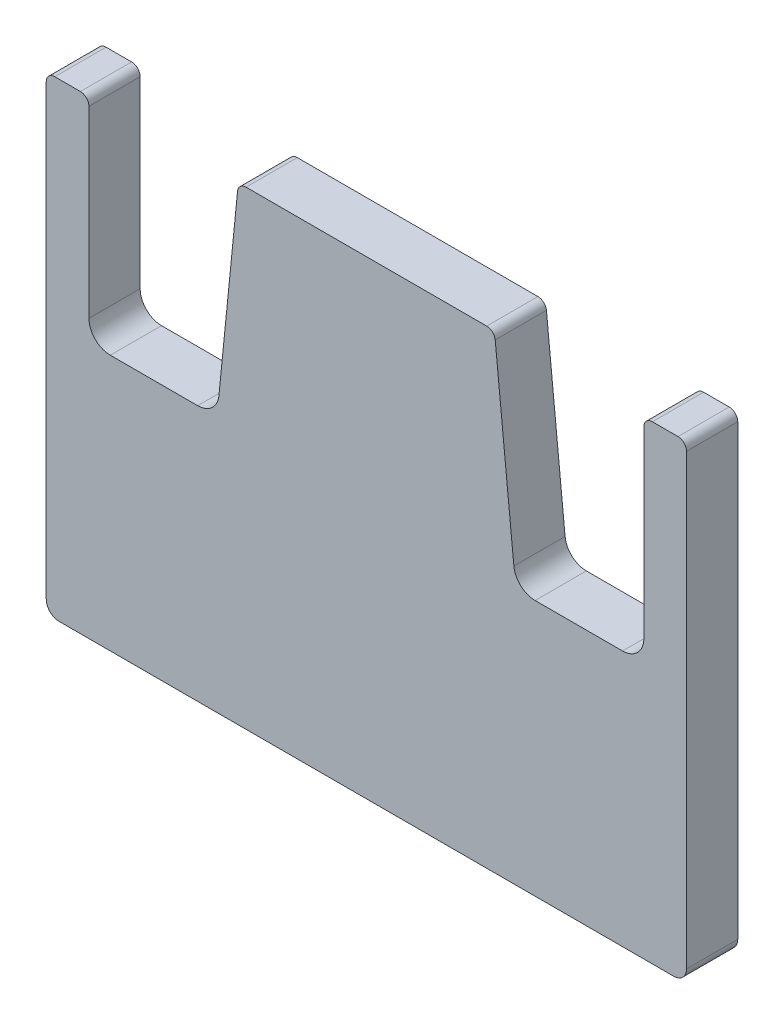
ISO-10303-21;
HEADER;
FILE_DESCRIPTION(('STEP AP214'),'2;1');
FILE_NAME('part.step','',(''),(''),'','','');
FILE_SCHEMA(('AUTOMOTIVE_DESIGN { 1 0 10303 214 1 1 1 1 }'));
ENDSEC;
DATA;
#1=APPLICATION_CONTEXT('core data for automotive mechanical design processes');
#2=APPLICATION_PROTOCOL_DEFINITION('international standard','automotive_design',2000,#1);
#3=PRODUCT_CONTEXT('',#1,'mechanical');
#4=PRODUCT('Part','Part','',(#3));
#5=PRODUCT_RELATED_PRODUCT_CATEGORY('part','',(#4));
#6=PRODUCT_DEFINITION_FORMATION('','',#4);
#7=PRODUCT_DEFINITION_CONTEXT('part definition',#1,'design');
#8=PRODUCT_DEFINITION('design','',#6,#7);
#9=PRODUCT_DEFINITION_SHAPE('','',#8);
#10=(LENGTH_UNIT() NAMED_UNIT(*) SI_UNIT(.MILLI.,.METRE.));
#11=(NAMED_UNIT(*) PLANE_ANGLE_UNIT() SI_UNIT($,.RADIAN.));
#12=(NAMED_UNIT(*) SI_UNIT($,.STERADIAN.) SOLID_ANGLE_UNIT());
#13=UNCERTAINTY_MEASURE_WITH_UNIT(LENGTH_MEASURE(1.E-05),#10,'distance_accuracy_value','');
#14=(GEOMETRIC_REPRESENTATION_CONTEXT(3) GLOBAL_UNCERTAINTY_ASSIGNED_CONTEXT((#13)) GLOBAL_UNIT_ASSIGNED_CONTEXT((#10,
#11,#12)) REPRESENTATION_CONTEXT('',''));
#15=CARTESIAN_POINT('',(0.,0.,0.));
#16=DIRECTION('',(0.,0.,1.));
#17=DIRECTION('',(1.,0.,0.));
#18=AXIS2_PLACEMENT_3D('',#15,#16,#17);
#19=CARTESIAN_POINT('',(150.,110.,12.));
#20=DIRECTION('',(0.,-1.,0.));
#21=DIRECTION('',(1.,0.,0.));
#22=AXIS2_PLACEMENT_3D('',#19,#20,#21);
#23=PLANE('',#22);
#24=DIRECTION('',(-1.,0.,0.));
#25=VECTOR('',#24,1.);
#26=CARTESIAN_POINT('',(150.,110.,0.));
#27=LINE('',#26,#25);
#28=CARTESIAN_POINT('',(8.00000000000001,110.,0.));
#29=VERTEX_POINT('',#28);
#30=CARTESIAN_POINT('',(2.,110.,0.));
#31=VERTEX_POINT('',#30);
#32=EDGE_CURVE('E254',#29,#31,#27,.T.);
#33=ORIENTED_EDGE('',*,*,#32,.T.);
#34=DIRECTION('',(0.,0.,-1.));
#35=VECTOR('',#34,1.);
#36=CARTESIAN_POINT('',(2.,110.,12.));
#37=LINE('',#36,#35);
#38=CARTESIAN_POINT('',(2.,110.,12.));
#39=VERTEX_POINT('',#38);
#40=EDGE_CURVE('E327',#31,#39,#37,.F.);
#41=ORIENTED_EDGE('',*,*,#40,.T.);
#42=DIRECTION('',(-1.,0.,0.));
#43=VECTOR('',#42,1.);
#44=CARTESIAN_POINT('',(150.,110.,12.));
#45=LINE('',#44,#43);
#46=CARTESIAN_POINT('',(8.00000000000001,110.,12.));
#47=VERTEX_POINT('',#46);
#48=EDGE_CURVE('E245',#47,#39,#45,.T.);
#49=ORIENTED_EDGE('',*,*,#48,.F.);
#50=DIRECTION('',(0.,0.,1.));
#51=VECTOR('',#50,1.);
#52=CARTESIAN_POINT('',(8.00000000000001,110.,12.));
#53=LINE('',#52,#51);
#54=EDGE_CURVE('E325',#47,#29,#53,.F.);
#55=ORIENTED_EDGE('',*,*,#54,.T.);
#56=EDGE_LOOP('',(#33,#41,#49,#55));
#57=FACE_BOUND('',#56,.T.);
#58=ADVANCED_FACE('F33',(#57),#23,.F.);
#59=CARTESIAN_POINT('',(148.,110.,12.));
#60=VERTEX_POINT('',#59);
#61=CARTESIAN_POINT('',(142.,110.,12.));
#62=VERTEX_POINT('',#61);
#63=EDGE_CURVE('E218',#60,#62,#45,.T.);
#64=ORIENTED_EDGE('',*,*,#63,.F.);
#65=DIRECTION('',(0.,0.,-1.));
#66=VECTOR('',#65,1.);
#67=CARTESIAN_POINT('',(148.,110.,12.));
#68=LINE('',#67,#66);
#69=CARTESIAN_POINT('',(148.,110.,0.));
#70=VERTEX_POINT('',#69);
#71=EDGE_CURVE('E292',#60,#70,#68,.T.);
#72=ORIENTED_EDGE('',*,*,#71,.T.);
#73=CARTESIAN_POINT('',(142.,110.,0.));
#74=VERTEX_POINT('',#73);
#75=EDGE_CURVE('E241',#70,#74,#27,.T.);
#76=ORIENTED_EDGE('',*,*,#75,.T.);
#77=DIRECTION('',(0.,0.,1.));
#78=VECTOR('',#77,1.);
#79=CARTESIAN_POINT('',(142.,110.,12.));
#80=LINE('',#79,#78);
#81=EDGE_CURVE('E289',#74,#62,#80,.T.);
#82=ORIENTED_EDGE('',*,*,#81,.T.);
#83=EDGE_LOOP('',(#64,#72,#76,#82));
#84=FACE_BOUND('',#83,.T.);
#85=ADVANCED_FACE('F392',(#84),#23,.F.);
#86=CARTESIAN_POINT('',(0.,0.,12.));
#87=DIRECTION('',(1.,0.,0.));
#88=DIRECTION('',(0.,0.,-1.));
#89=AXIS2_PLACEMENT_3D('',#86,#87,#88);
#90=PLANE('',#89);
#91=DIRECTION('',(0.,-1.,0.));
#92=VECTOR('',#91,1.);
#93=CARTESIAN_POINT('',(0.,0.,0.));
#94=LINE('',#93,#92);
#95=CARTESIAN_POINT('',(0.,108.,0.));
#96=VERTEX_POINT('',#95);
#97=CARTESIAN_POINT('',(0.,3.,0.));
#98=VERTEX_POINT('',#97);
#99=EDGE_CURVE('E237',#96,#98,#94,.T.);
#100=ORIENTED_EDGE('',*,*,#99,.T.);
#101=DIRECTION('',(0.,0.,-1.));
#102=VECTOR('',#101,1.);
#103=CARTESIAN_POINT('',(0.,3.,12.));
#104=LINE('',#103,#102);
#105=CARTESIAN_POINT('',(0.,3.,12.));
#106=VERTEX_POINT('',#105);
#107=EDGE_CURVE('E11',#98,#106,#104,.F.);
#108=ORIENTED_EDGE('',*,*,#107,.T.);
#109=DIRECTION('',(0.,-1.,0.));
#110=VECTOR('',#109,1.);
#111=CARTESIAN_POINT('',(0.,0.,12.));
#112=LINE('',#111,#110);
#113=CARTESIAN_POINT('',(0.,108.,12.));
#114=VERTEX_POINT('',#113);
#115=EDGE_CURVE('E238',#114,#106,#112,.T.);
#116=ORIENTED_EDGE('',*,*,#115,.F.);
#117=DIRECTION('',(0.,0.,-1.));
#118=VECTOR('',#117,1.);
#119=CARTESIAN_POINT('',(0.,108.,12.));
#120=LINE('',#119,#118);
#121=EDGE_CURVE('E322',#114,#96,#120,.T.);
#122=ORIENTED_EDGE('',*,*,#121,.T.);
#123=EDGE_LOOP('',(#100,#108,#116,#122));
#124=FACE_BOUND('',#123,.T.);
#125=ADVANCED_FACE('F374',(#124),#90,.F.);
#126=CARTESIAN_POINT('',(0.,0.,12.));
#127=DIRECTION('',(0.,1.,0.));
#128=DIRECTION('',(-1.,0.,0.));
#129=AXIS2_PLACEMENT_3D('',#126,#127,#128);
#130=PLANE('',#129);
#131=DIRECTION('',(1.,0.,0.));
#132=VECTOR('',#131,1.);
#133=CARTESIAN_POINT('',(0.,0.,0.));
#134=LINE('',#133,#132);
#135=CARTESIAN_POINT('',(3.,0.,0.));
#136=VERTEX_POINT('',#135);
#137=CARTESIAN_POINT('',(147.,0.,0.));
#138=VERTEX_POINT('',#137);
#139=EDGE_CURVE('E250',#136,#138,#134,.T.);
#140=ORIENTED_EDGE('',*,*,#139,.T.);
#141=DIRECTION('',(0.,0.,-1.));
#142=VECTOR('',#141,1.);
#143=CARTESIAN_POINT('',(147.,0.,12.));
#144=LINE('',#143,#142);
#145=CARTESIAN_POINT('',(147.,0.,12.));
#146=VERTEX_POINT('',#145);
#147=EDGE_CURVE('E54',#138,#146,#144,.F.);
#148=ORIENTED_EDGE('',*,*,#147,.T.);
#149=DIRECTION('',(1.,0.,0.));
#150=VECTOR('',#149,1.);
#151=CARTESIAN_POINT('',(0.,0.,12.));
#152=LINE('',#151,#150);
#153=CARTESIAN_POINT('',(3.,0.,12.));
#154=VERTEX_POINT('',#153);
#155=EDGE_CURVE('E240',#154,#146,#152,.T.);
#156=ORIENTED_EDGE('',*,*,#155,.F.);
#157=DIRECTION('',(0.,0.,-1.));
#158=VECTOR('',#157,1.);
#159=CARTESIAN_POINT('',(3.,0.,12.));
#160=LINE('',#159,#158);
#161=EDGE_CURVE('E351',#154,#136,#160,.T.);
#162=ORIENTED_EDGE('',*,*,#161,.T.);
#163=EDGE_LOOP('',(#140,#148,#156,#162));
#164=FACE_BOUND('',#163,.T.);
#165=ADVANCED_FACE('F369',(#164),#130,.F.);
#166=CARTESIAN_POINT('',(150.,0.,12.));
#167=DIRECTION('',(-1.,0.,0.));
#168=DIRECTION('',(0.,-1.,0.));
#169=AXIS2_PLACEMENT_3D('',#166,#167,#168);
#170=PLANE('',#169);
#171=DIRECTION('',(0.,1.,0.));
#172=VECTOR('',#171,1.);
#173=CARTESIAN_POINT('',(150.,0.,12.));
#174=LINE('',#173,#172);
#175=CARTESIAN_POINT('',(150.,3.00000000000002,12.));
#176=VERTEX_POINT('',#175);
#177=CARTESIAN_POINT('',(150.,108.,12.));
#178=VERTEX_POINT('',#177);
#179=EDGE_CURVE('E243',#176,#178,#174,.T.);
#180=ORIENTED_EDGE('',*,*,#179,.F.);
#181=DIRECTION('',(0.,0.,-1.));
#182=VECTOR('',#181,1.);
#183=CARTESIAN_POINT('',(150.,3.00000000000002,12.));
#184=LINE('',#183,#182);
#185=CARTESIAN_POINT('',(150.,3.00000000000002,0.));
#186=VERTEX_POINT('',#185);
#187=EDGE_CURVE('E344',#176,#186,#184,.T.);
#188=ORIENTED_EDGE('',*,*,#187,.T.);
#189=DIRECTION('',(0.,1.,0.));
#190=VECTOR('',#189,1.);
#191=CARTESIAN_POINT('',(150.,0.,0.));
#192=LINE('',#191,#190);
#193=CARTESIAN_POINT('',(150.,108.,0.));
#194=VERTEX_POINT('',#193);
#195=EDGE_CURVE('E252',#186,#194,#192,.T.);
#196=ORIENTED_EDGE('',*,*,#195,.T.);
#197=DIRECTION('',(0.,0.,-1.));
#198=VECTOR('',#197,1.);
#199=CARTESIAN_POINT('',(150.,108.,12.));
#200=LINE('',#199,#198);
#201=EDGE_CURVE('E308',#194,#178,#200,.F.);
#202=ORIENTED_EDGE('',*,*,#201,.T.);
#203=EDGE_LOOP('',(#180,#188,#196,#202));
#204=FACE_BOUND('',#203,.T.);
#205=ADVANCED_FACE('F361',(#204),#170,.F.);
#206=CARTESIAN_POINT('',(103.190024875776,110.,12.));
#207=VERTEX_POINT('',#206);
#208=CARTESIAN_POINT('',(46.8099751242242,110.,12.));
#209=VERTEX_POINT('',#208);
#210=EDGE_CURVE('E246',#207,#209,#45,.T.);
#211=ORIENTED_EDGE('',*,*,#210,.F.);
#212=DIRECTION('',(0.,0.,1.));
#213=VECTOR('',#212,1.);
#214=CARTESIAN_POINT('',(103.190024875776,110.,12.));
#215=LINE('',#214,#213);
#216=CARTESIAN_POINT('',(103.190024875776,110.,0.));
#217=VERTEX_POINT('',#216);
#218=EDGE_CURVE('E337',#207,#217,#215,.F.);
#219=ORIENTED_EDGE('',*,*,#218,.T.);
#220=CARTESIAN_POINT('',(46.8099751242242,110.,0.));
#221=VERTEX_POINT('',#220);
#222=EDGE_CURVE('E255',#217,#221,#27,.T.);
#223=ORIENTED_EDGE('',*,*,#222,.T.);
#224=DIRECTION('',(0.,0.,1.));
#225=VECTOR('',#224,1.);
#226=CARTESIAN_POINT('',(46.8099751242242,110.,12.));
#227=LINE('',#226,#225);
#228=EDGE_CURVE('E334',#221,#209,#227,.T.);
#229=ORIENTED_EDGE('',*,*,#228,.T.);
#230=EDGE_LOOP('',(#211,#219,#223,#229));
#231=FACE_BOUND('',#230,.T.);
#232=ADVANCED_FACE('F432',(#231),#23,.F.);
#233=CARTESIAN_POINT('',(0.,0.,12.));
#234=DIRECTION('',(0.,0.,1.));
#235=DIRECTION('',(1.,0.,0.));
#236=AXIS2_PLACEMENT_3D('',#233,#234,#235);
#237=PLANE('',#236);
#238=ORIENTED_EDGE('',*,*,#155,.T.);
#239=CARTESIAN_POINT('',(147.,3.00000000000002,12.));
#240=DIRECTION('',(0.,0.,1.));
#241=DIRECTION('',(1.,0.,0.));
#242=AXIS2_PLACEMENT_3D('',#239,#240,#241);
#243=CIRCLE('',#242,3.);
#244=EDGE_CURVE('E41',#146,#176,#243,.T.);
#245=ORIENTED_EDGE('',*,*,#244,.T.);
#246=ORIENTED_EDGE('',*,*,#179,.T.);
#247=CARTESIAN_POINT('',(148.,108.,12.));
#248=DIRECTION('',(0.,0.,1.));
#249=DIRECTION('',(1.,0.,0.));
#250=AXIS2_PLACEMENT_3D('',#247,#248,#249);
#251=CIRCLE('',#250,2.);
#252=EDGE_CURVE('E320',#178,#60,#251,.T.);
#253=ORIENTED_EDGE('',*,*,#252,.T.);
#254=ORIENTED_EDGE('',*,*,#63,.T.);
#255=CARTESIAN_POINT('',(142.,108.,12.));
#256=DIRECTION('',(0.,0.,1.));
#257=DIRECTION('',(1.,0.,0.));
#258=AXIS2_PLACEMENT_3D('',#255,#256,#257);
#259=CIRCLE('',#258,2.);
#260=CARTESIAN_POINT('',(140.,108.,12.));
#261=VERTEX_POINT('',#260);
#262=EDGE_CURVE('E222',#62,#261,#259,.T.);
#263=ORIENTED_EDGE('',*,*,#262,.T.);
#264=DIRECTION('',(0.,1.,0.));
#265=VECTOR('',#264,1.);
#266=CARTESIAN_POINT('',(140.,0.,12.));
#267=LINE('',#266,#265);
#268=CARTESIAN_POINT('',(140.,65.,12.));
#269=VERTEX_POINT('',#268);
#270=EDGE_CURVE('E213',#269,#261,#267,.T.);
#271=ORIENTED_EDGE('',*,*,#270,.F.);
#272=CARTESIAN_POINT('',(135.,65.,12.));
#273=DIRECTION('',(0.,0.,1.));
#274=DIRECTION('',(1.,0.,0.));
#275=AXIS2_PLACEMENT_3D('',#272,#273,#274);
#276=CIRCLE('',#275,5.);
#277=CARTESIAN_POINT('',(135.,60.,12.));
#278=VERTEX_POINT('',#277);
#279=EDGE_CURVE('E196',#269,#278,#276,.F.);
#280=ORIENTED_EDGE('',*,*,#279,.T.);
#281=DIRECTION('',(1.,0.,0.));
#282=VECTOR('',#281,1.);
#283=CARTESIAN_POINT('',(0.,60.,12.));
#284=LINE('',#283,#282);
#285=CARTESIAN_POINT('',(114.52493781056,60.,12.));
#286=VERTEX_POINT('',#285);
#287=EDGE_CURVE('E224',#286,#278,#284,.T.);
#288=ORIENTED_EDGE('',*,*,#287,.F.);
#289=CARTESIAN_POINT('',(114.52493781056,65.,12.));
#290=DIRECTION('',(0.,0.,1.));
#291=DIRECTION('',(1.,0.,0.));
#292=AXIS2_PLACEMENT_3D('',#289,#290,#291);
#293=CIRCLE('',#292,5.);
#294=CARTESIAN_POINT('',(109.54975185951,64.502481404895,12.));
#295=VERTEX_POINT('',#294);
#296=EDGE_CURVE('E275',#286,#295,#293,.F.);
#297=ORIENTED_EDGE('',*,*,#296,.T.);
#298=DIRECTION('',(0.099503719020999,-0.995037190209989,0.));
#299=VECTOR('',#298,1.);
#300=CARTESIAN_POINT('',(114.851485148515,11.4851485148515,12.));
#301=LINE('',#300,#299);
#302=CARTESIAN_POINT('',(105.180099256196,108.199007438042,12.));
#303=VERTEX_POINT('',#302);
#304=EDGE_CURVE('E229',#303,#295,#301,.T.);
#305=ORIENTED_EDGE('',*,*,#304,.F.);
#306=CARTESIAN_POINT('',(103.190024875776,108.,12.));
#307=DIRECTION('',(0.,0.,1.));
#308=DIRECTION('',(1.,0.,0.));
#309=AXIS2_PLACEMENT_3D('',#306,#307,#308);
#310=CIRCLE('',#309,2.);
#311=EDGE_CURVE('E315',#303,#207,#310,.T.);
#312=ORIENTED_EDGE('',*,*,#311,.T.);
#313=ORIENTED_EDGE('',*,*,#210,.T.);
#314=CARTESIAN_POINT('',(46.8099751242242,108.,12.));
#315=DIRECTION('',(0.,0.,1.));
#316=DIRECTION('',(1.,0.,0.));
#317=AXIS2_PLACEMENT_3D('',#314,#315,#316);
#318=CIRCLE('',#317,2.);
#319=CARTESIAN_POINT('',(44.8199007438042,108.199007438042,12.));
#320=VERTEX_POINT('',#319);
#321=EDGE_CURVE('E313',#209,#320,#318,.T.);
#322=ORIENTED_EDGE('',*,*,#321,.T.);
#323=DIRECTION('',(0.0995037190209987,0.995037190209989,0.));
#324=VECTOR('',#323,1.);
#325=CARTESIAN_POINT('',(33.6633663366337,-3.36633663366336,12.));
#326=LINE('',#325,#324);
#327=CARTESIAN_POINT('',(40.4502481404895,64.502481404895,12.));
#328=VERTEX_POINT('',#327);
#329=EDGE_CURVE('E227',#328,#320,#326,.T.);
#330=ORIENTED_EDGE('',*,*,#329,.F.);
#331=CARTESIAN_POINT('',(35.4750621894396,65.,12.));
#332=DIRECTION('',(0.,0.,1.));
#333=DIRECTION('',(1.,0.,0.));
#334=AXIS2_PLACEMENT_3D('',#331,#332,#333);
#335=CIRCLE('',#334,5.);
#336=CARTESIAN_POINT('',(35.4750621894396,60.,12.));
#337=VERTEX_POINT('',#336);
#338=EDGE_CURVE('E280',#328,#337,#335,.F.);
#339=ORIENTED_EDGE('',*,*,#338,.T.);
#340=DIRECTION('',(1.,0.,0.));
#341=VECTOR('',#340,1.);
#342=CARTESIAN_POINT('',(0.,60.,12.));
#343=LINE('',#342,#341);
#344=CARTESIAN_POINT('',(15.,60.,12.));
#345=VERTEX_POINT('',#344);
#346=EDGE_CURVE('E223',#345,#337,#343,.T.);
#347=ORIENTED_EDGE('',*,*,#346,.F.);
#348=CARTESIAN_POINT('',(15.,65.,12.));
#349=DIRECTION('',(0.,0.,1.));
#350=DIRECTION('',(1.,0.,0.));
#351=AXIS2_PLACEMENT_3D('',#348,#349,#350);
#352=CIRCLE('',#351,5.);
#353=CARTESIAN_POINT('',(10.,65.,12.));
#354=VERTEX_POINT('',#353);
#355=EDGE_CURVE('E284',#345,#354,#352,.F.);
#356=ORIENTED_EDGE('',*,*,#355,.T.);
#357=DIRECTION('',(0.,-1.,0.));
#358=VECTOR('',#357,1.);
#359=CARTESIAN_POINT('',(10.,0.,12.));
#360=LINE('',#359,#358);
#361=CARTESIAN_POINT('',(10.,108.,12.));
#362=VERTEX_POINT('',#361);
#363=EDGE_CURVE('E235',#362,#354,#360,.T.);
#364=ORIENTED_EDGE('',*,*,#363,.F.);
#365=CARTESIAN_POINT('',(8.,108.,12.));
#366=DIRECTION('',(0.,0.,1.));
#367=DIRECTION('',(1.,0.,0.));
#368=AXIS2_PLACEMENT_3D('',#365,#366,#367);
#369=CIRCLE('',#368,2.);
#370=EDGE_CURVE('E311',#362,#47,#369,.T.);
#371=ORIENTED_EDGE('',*,*,#370,.T.);
#372=ORIENTED_EDGE('',*,*,#48,.T.);
#373=CARTESIAN_POINT('',(2.,108.,12.));
#374=DIRECTION('',(0.,0.,1.));
#375=DIRECTION('',(1.,0.,0.));
#376=AXIS2_PLACEMENT_3D('',#373,#374,#375);
#377=CIRCLE('',#376,2.);
#378=EDGE_CURVE('E318',#39,#114,#377,.T.);
#379=ORIENTED_EDGE('',*,*,#378,.T.);
#380=ORIENTED_EDGE('',*,*,#115,.T.);
#381=CARTESIAN_POINT('',(3.,3.,12.));
#382=DIRECTION('',(0.,0.,1.));
#383=DIRECTION('',(1.,0.,0.));
#384=AXIS2_PLACEMENT_3D('',#381,#382,#383);
#385=CIRCLE('',#384,3.);
#386=EDGE_CURVE('E355',#106,#154,#385,.T.);
#387=ORIENTED_EDGE('',*,*,#386,.T.);
#388=EDGE_LOOP('',(#238,#245,#246,#253,#254,#263,#271,#280,#288,#297,#305,#312,#313,#322,#330,
#339,#347,#356,#364,#371,#372,#379,#380,#387));
#389=FACE_BOUND('',#388,.T.);
#390=ADVANCED_FACE('F220',(#389),#237,.T.);
#391=CARTESIAN_POINT('',(0.,0.,0.));
#392=DIRECTION('',(0.,0.,1.));
#393=DIRECTION('',(1.,0.,0.));
#394=AXIS2_PLACEMENT_3D('',#391,#392,#393);
#395=PLANE('',#394);
#396=ORIENTED_EDGE('',*,*,#195,.F.);
#397=CARTESIAN_POINT('',(147.,3.00000000000002,0.));
#398=DIRECTION('',(0.,0.,1.));
#399=DIRECTION('',(1.,0.,0.));
#400=AXIS2_PLACEMENT_3D('',#397,#398,#399);
#401=CIRCLE('',#400,3.);
#402=EDGE_CURVE('E349',#186,#138,#401,.F.);
#403=ORIENTED_EDGE('',*,*,#402,.T.);
#404=ORIENTED_EDGE('',*,*,#139,.F.);
#405=CARTESIAN_POINT('',(3.,3.,0.));
#406=DIRECTION('',(0.,0.,1.));
#407=DIRECTION('',(1.,0.,0.));
#408=AXIS2_PLACEMENT_3D('',#405,#406,#407);
#409=CIRCLE('',#408,3.);
#410=EDGE_CURVE('E347',#136,#98,#409,.F.);
#411=ORIENTED_EDGE('',*,*,#410,.T.);
#412=ORIENTED_EDGE('',*,*,#99,.F.);
#413=CARTESIAN_POINT('',(2.,108.,0.));
#414=DIRECTION('',(0.,0.,1.));
#415=DIRECTION('',(1.,0.,0.));
#416=AXIS2_PLACEMENT_3D('',#413,#414,#415);
#417=CIRCLE('',#416,2.);
#418=EDGE_CURVE('E303',#96,#31,#417,.F.);
#419=ORIENTED_EDGE('',*,*,#418,.T.);
#420=ORIENTED_EDGE('',*,*,#32,.F.);
#421=CARTESIAN_POINT('',(8.,108.,0.));
#422=DIRECTION('',(0.,0.,1.));
#423=DIRECTION('',(1.,0.,0.));
#424=AXIS2_PLACEMENT_3D('',#421,#422,#423);
#425=CIRCLE('',#424,2.);
#426=CARTESIAN_POINT('',(10.,108.,0.));
#427=VERTEX_POINT('',#426);
#428=EDGE_CURVE('E295',#29,#427,#425,.F.);
#429=ORIENTED_EDGE('',*,*,#428,.T.);
#430=DIRECTION('',(0.,-1.,0.));
#431=VECTOR('',#430,1.);
#432=CARTESIAN_POINT('',(10.,110.,0.));
#433=LINE('',#432,#431);
#434=CARTESIAN_POINT('',(10.,65.,0.));
#435=VERTEX_POINT('',#434);
#436=EDGE_CURVE('E398',#427,#435,#433,.T.);
#437=ORIENTED_EDGE('',*,*,#436,.T.);
#438=CARTESIAN_POINT('',(15.,65.,0.));
#439=DIRECTION('',(0.,0.,1.));
#440=DIRECTION('',(1.,0.,0.));
#441=AXIS2_PLACEMENT_3D('',#438,#439,#440);
#442=CIRCLE('',#441,5.);
#443=CARTESIAN_POINT('',(15.,60.,0.));
#444=VERTEX_POINT('',#443);
#445=EDGE_CURVE('E287',#435,#444,#442,.T.);
#446=ORIENTED_EDGE('',*,*,#445,.T.);
#447=DIRECTION('',(1.,0.,0.));
#448=VECTOR('',#447,1.);
#449=CARTESIAN_POINT('',(10.,60.,0.));
#450=LINE('',#449,#448);
#451=CARTESIAN_POINT('',(35.4750621894396,60.,0.));
#452=VERTEX_POINT('',#451);
#453=EDGE_CURVE('E401',#444,#452,#450,.T.);
#454=ORIENTED_EDGE('',*,*,#453,.T.);
#455=CARTESIAN_POINT('',(35.4750621894396,65.,0.));
#456=DIRECTION('',(0.,0.,1.));
#457=DIRECTION('',(1.,0.,0.));
#458=AXIS2_PLACEMENT_3D('',#455,#456,#457);
#459=CIRCLE('',#458,5.);
#460=CARTESIAN_POINT('',(40.4502481404895,64.502481404895,0.));
#461=VERTEX_POINT('',#460);
#462=EDGE_CURVE('E282',#452,#461,#459,.T.);
#463=ORIENTED_EDGE('',*,*,#462,.T.);
#464=DIRECTION('',(0.0995037190209987,0.995037190209989,0.));
#465=VECTOR('',#464,1.);
#466=CARTESIAN_POINT('',(45.,110.,0.));
#467=LINE('',#466,#465);
#468=CARTESIAN_POINT('',(44.8199007438042,108.199007438042,0.));
#469=VERTEX_POINT('',#468);
#470=EDGE_CURVE('E406',#461,#469,#467,.T.);
#471=ORIENTED_EDGE('',*,*,#470,.T.);
#472=CARTESIAN_POINT('',(46.8099751242242,108.,0.));
#473=DIRECTION('',(0.,0.,1.));
#474=DIRECTION('',(1.,0.,0.));
#475=AXIS2_PLACEMENT_3D('',#472,#473,#474);
#476=CIRCLE('',#475,2.);
#477=EDGE_CURVE('E297',#469,#221,#476,.F.);
#478=ORIENTED_EDGE('',*,*,#477,.T.);
#479=ORIENTED_EDGE('',*,*,#222,.F.);
#480=CARTESIAN_POINT('',(103.190024875776,108.,0.));
#481=DIRECTION('',(0.,0.,1.));
#482=DIRECTION('',(1.,0.,0.));
#483=AXIS2_PLACEMENT_3D('',#480,#481,#482);
#484=CIRCLE('',#483,2.);
#485=CARTESIAN_POINT('',(105.180099256196,108.199007438042,0.));
#486=VERTEX_POINT('',#485);
#487=EDGE_CURVE('E299',#217,#486,#484,.F.);
#488=ORIENTED_EDGE('',*,*,#487,.T.);
#489=DIRECTION('',(0.099503719020999,-0.995037190209989,0.));
#490=VECTOR('',#489,1.);
#491=CARTESIAN_POINT('',(105.,110.,0.));
#492=LINE('',#491,#490);
#493=CARTESIAN_POINT('',(109.54975185951,64.502481404895,0.));
#494=VERTEX_POINT('',#493);
#495=EDGE_CURVE('E403',#486,#494,#492,.T.);
#496=ORIENTED_EDGE('',*,*,#495,.T.);
#497=CARTESIAN_POINT('',(114.52493781056,65.,0.));
#498=DIRECTION('',(0.,0.,1.));
#499=DIRECTION('',(1.,0.,0.));
#500=AXIS2_PLACEMENT_3D('',#497,#498,#499);
#501=CIRCLE('',#500,5.);
#502=CARTESIAN_POINT('',(114.52493781056,60.,0.));
#503=VERTEX_POINT('',#502);
#504=EDGE_CURVE('E278',#494,#503,#501,.T.);
#505=ORIENTED_EDGE('',*,*,#504,.T.);
#506=DIRECTION('',(1.,0.,0.));
#507=VECTOR('',#506,1.);
#508=CARTESIAN_POINT('',(140.,60.,0.));
#509=LINE('',#508,#507);
#510=CARTESIAN_POINT('',(135.,60.,0.));
#511=VERTEX_POINT('',#510);
#512=EDGE_CURVE('E399',#503,#511,#509,.T.);
#513=ORIENTED_EDGE('',*,*,#512,.T.);
#514=CARTESIAN_POINT('',(135.,65.,0.));
#515=DIRECTION('',(0.,0.,1.));
#516=DIRECTION('',(1.,0.,0.));
#517=AXIS2_PLACEMENT_3D('',#514,#515,#516);
#518=CIRCLE('',#517,5.);
#519=CARTESIAN_POINT('',(140.,65.,0.));
#520=VERTEX_POINT('',#519);
#521=EDGE_CURVE('E206',#511,#520,#518,.T.);
#522=ORIENTED_EDGE('',*,*,#521,.T.);
#523=DIRECTION('',(0.,1.,0.));
#524=VECTOR('',#523,1.);
#525=CARTESIAN_POINT('',(140.,110.,0.));
#526=LINE('',#525,#524);
#527=CARTESIAN_POINT('',(140.,108.,0.));
#528=VERTEX_POINT('',#527);
#529=EDGE_CURVE('E216',#520,#528,#526,.T.);
#530=ORIENTED_EDGE('',*,*,#529,.T.);
#531=CARTESIAN_POINT('',(142.,108.,0.));
#532=DIRECTION('',(0.,0.,1.));
#533=DIRECTION('',(1.,0.,0.));
#534=AXIS2_PLACEMENT_3D('',#531,#532,#533);
#535=CIRCLE('',#534,2.);
#536=EDGE_CURVE('E301',#528,#74,#535,.F.);
#537=ORIENTED_EDGE('',*,*,#536,.T.);
#538=ORIENTED_EDGE('',*,*,#75,.F.);
#539=CARTESIAN_POINT('',(148.,108.,0.));
#540=DIRECTION('',(0.,0.,1.));
#541=DIRECTION('',(1.,0.,0.));
#542=AXIS2_PLACEMENT_3D('',#539,#540,#541);
#543=CIRCLE('',#542,2.);
#544=EDGE_CURVE('E305',#70,#194,#543,.F.);
#545=ORIENTED_EDGE('',*,*,#544,.T.);
#546=EDGE_LOOP('',(#396,#403,#404,#411,#412,#419,#420,#429,#437,#446,#454,#463,#471,#478,#479,
#488,#496,#505,#513,#522,#530,#537,#538,#545));
#547=FACE_BOUND('',#546,.T.);
#548=ADVANCED_FACE('F368',(#547),#395,.F.);
#549=CARTESIAN_POINT('',(140.,110.,0.));
#550=DIRECTION('',(1.,0.,0.));
#551=DIRECTION('',(0.,1.,0.));
#552=AXIS2_PLACEMENT_3D('',#549,#550,#551);
#553=PLANE('',#552);
#554=ORIENTED_EDGE('',*,*,#270,.T.);
#555=DIRECTION('',(0.,0.,1.));
#556=VECTOR('',#555,1.);
#557=CARTESIAN_POINT('',(140.,108.,0.));
#558=LINE('',#557,#556);
#559=EDGE_CURVE('E329',#261,#528,#558,.F.);
#560=ORIENTED_EDGE('',*,*,#559,.T.);
#561=ORIENTED_EDGE('',*,*,#529,.F.);
#562=DIRECTION('',(0.,0.,1.));
#563=VECTOR('',#562,1.);
#564=CARTESIAN_POINT('',(140.,65.,12.));
#565=LINE('',#564,#563);
#566=EDGE_CURVE('E200',#520,#269,#565,.T.);
#567=ORIENTED_EDGE('',*,*,#566,.T.);
#568=EDGE_LOOP('',(#554,#560,#561,#567));
#569=FACE_BOUND('',#568,.T.);
#570=ADVANCED_FACE('F212',(#569),#553,.F.);
#571=CARTESIAN_POINT('',(140.,60.,0.));
#572=DIRECTION('',(0.,-1.,0.));
#573=DIRECTION('',(0.,0.,-1.));
#574=AXIS2_PLACEMENT_3D('',#571,#572,#573);
#575=PLANE('',#574);
#576=ORIENTED_EDGE('',*,*,#287,.T.);
#577=DIRECTION('',(0.,0.,1.));
#578=VECTOR('',#577,1.);
#579=CARTESIAN_POINT('',(135.,60.,0.));
#580=LINE('',#579,#578);
#581=EDGE_CURVE('E201',#278,#511,#580,.F.);
#582=ORIENTED_EDGE('',*,*,#581,.T.);
#583=ORIENTED_EDGE('',*,*,#512,.F.);
#584=DIRECTION('',(0.,0.,1.));
#585=VECTOR('',#584,1.);
#586=CARTESIAN_POINT('',(114.52493781056,60.,12.));
#587=LINE('',#586,#585);
#588=EDGE_CURVE('E217',#503,#286,#587,.T.);
#589=ORIENTED_EDGE('',*,*,#588,.T.);
#590=EDGE_LOOP('',(#576,#582,#583,#589));
#591=FACE_BOUND('',#590,.T.);
#592=ADVANCED_FACE('F427',(#591),#575,.F.);
#593=CARTESIAN_POINT('',(105.,110.,0.));
#594=DIRECTION('',(-0.995037190209989,-0.099503719020999,0.));
#595=DIRECTION('',(0.099503719020999,-0.995037190209989,0.));
#596=AXIS2_PLACEMENT_3D('',#593,#594,#595);
#597=PLANE('',#596);
#598=ORIENTED_EDGE('',*,*,#495,.F.);
#599=DIRECTION('',(0.,0.,1.));
#600=VECTOR('',#599,1.);
#601=CARTESIAN_POINT('',(105.180099256196,108.199007438042,0.));
#602=LINE('',#601,#600);
#603=EDGE_CURVE('E331',#486,#303,#602,.T.);
#604=ORIENTED_EDGE('',*,*,#603,.T.);
#605=ORIENTED_EDGE('',*,*,#304,.T.);
#606=DIRECTION('',(0.,0.,1.));
#607=VECTOR('',#606,1.);
#608=CARTESIAN_POINT('',(109.54975185951,64.502481404895,0.));
#609=LINE('',#608,#607);
#610=EDGE_CURVE('E261',#295,#494,#609,.F.);
#611=ORIENTED_EDGE('',*,*,#610,.T.);
#612=EDGE_LOOP('',(#598,#604,#605,#611));
#613=FACE_BOUND('',#612,.T.);
#614=ADVANCED_FACE('F422',(#613),#597,.F.);
#615=CARTESIAN_POINT('',(10.,110.,0.));
#616=DIRECTION('',(-1.,0.,0.));
#617=DIRECTION('',(0.,-1.,0.));
#618=AXIS2_PLACEMENT_3D('',#615,#616,#617);
#619=PLANE('',#618);
#620=ORIENTED_EDGE('',*,*,#436,.F.);
#621=DIRECTION('',(0.,0.,1.));
#622=VECTOR('',#621,1.);
#623=CARTESIAN_POINT('',(10.,108.,0.));
#624=LINE('',#623,#622);
#625=EDGE_CURVE('E341',#427,#362,#624,.T.);
#626=ORIENTED_EDGE('',*,*,#625,.T.);
#627=ORIENTED_EDGE('',*,*,#363,.T.);
#628=DIRECTION('',(0.,0.,1.));
#629=VECTOR('',#628,1.);
#630=CARTESIAN_POINT('',(10.,65.,0.));
#631=LINE('',#630,#629);
#632=EDGE_CURVE('E207',#354,#435,#631,.F.);
#633=ORIENTED_EDGE('',*,*,#632,.T.);
#634=EDGE_LOOP('',(#620,#626,#627,#633));
#635=FACE_BOUND('',#634,.T.);
#636=ADVANCED_FACE('F577',(#635),#619,.F.);
#637=CARTESIAN_POINT('',(45.,110.,0.));
#638=DIRECTION('',(0.995037190209989,-0.0995037190209987,0.));
#639=DIRECTION('',(0.0995037190209987,0.995037190209989,0.));
#640=AXIS2_PLACEMENT_3D('',#637,#638,#639);
#641=PLANE('',#640);
#642=ORIENTED_EDGE('',*,*,#329,.T.);
#643=DIRECTION('',(0.,0.,1.));
#644=VECTOR('',#643,1.);
#645=CARTESIAN_POINT('',(44.8199007438042,108.199007438042,0.));
#646=LINE('',#645,#644);
#647=EDGE_CURVE('E339',#320,#469,#646,.F.);
#648=ORIENTED_EDGE('',*,*,#647,.T.);
#649=ORIENTED_EDGE('',*,*,#470,.F.);
#650=DIRECTION('',(0.,0.,1.));
#651=VECTOR('',#650,1.);
#652=CARTESIAN_POINT('',(40.4502481404895,64.502481404895,12.));
#653=LINE('',#652,#651);
#654=EDGE_CURVE('E264',#461,#328,#653,.T.);
#655=ORIENTED_EDGE('',*,*,#654,.T.);
#656=EDGE_LOOP('',(#642,#648,#649,#655));
#657=FACE_BOUND('',#656,.T.);
#658=ADVANCED_FACE('F584',(#657),#641,.F.);
#659=CARTESIAN_POINT('',(10.,60.,0.));
#660=DIRECTION('',(0.,-1.,0.));
#661=DIRECTION('',(1.,0.,0.));
#662=AXIS2_PLACEMENT_3D('',#659,#660,#661);
#663=PLANE('',#662);
#664=ORIENTED_EDGE('',*,*,#346,.T.);
#665=DIRECTION('',(0.,0.,1.));
#666=VECTOR('',#665,1.);
#667=CARTESIAN_POINT('',(35.4750621894396,60.,0.));
#668=LINE('',#667,#666);
#669=EDGE_CURVE('E270',#337,#452,#668,.F.);
#670=ORIENTED_EDGE('',*,*,#669,.T.);
#671=ORIENTED_EDGE('',*,*,#453,.F.);
#672=DIRECTION('',(0.,0.,1.));
#673=VECTOR('',#672,1.);
#674=CARTESIAN_POINT('',(15.,60.,12.));
#675=LINE('',#674,#673);
#676=EDGE_CURVE('E267',#444,#345,#675,.T.);
#677=ORIENTED_EDGE('',*,*,#676,.T.);
#678=EDGE_LOOP('',(#664,#670,#671,#677));
#679=FACE_BOUND('',#678,.T.);
#680=ADVANCED_FACE('F468',(#679),#663,.F.);
#681=CARTESIAN_POINT('',(135.,65.,0.));
#682=DIRECTION('',(0.,0.,-1.));
#683=DIRECTION('',(-1.,0.,0.));
#684=AXIS2_PLACEMENT_3D('',#681,#682,#683);
#685=CYLINDRICAL_SURFACE('',#684,5.);
#686=ORIENTED_EDGE('',*,*,#521,.F.);
#687=ORIENTED_EDGE('',*,*,#581,.F.);
#688=ORIENTED_EDGE('',*,*,#279,.F.);
#689=ORIENTED_EDGE('',*,*,#566,.F.);
#690=EDGE_LOOP('',(#686,#687,#688,#689));
#691=FACE_BOUND('',#690,.T.);
#692=ADVANCED_FACE('F199',(#691),#685,.F.);
#693=CARTESIAN_POINT('',(114.52493781056,65.,0.));
#694=DIRECTION('',(0.,0.,-1.));
#695=DIRECTION('',(-1.,0.,0.));
#696=AXIS2_PLACEMENT_3D('',#693,#694,#695);
#697=CYLINDRICAL_SURFACE('',#696,5.);
#698=ORIENTED_EDGE('',*,*,#504,.F.);
#699=ORIENTED_EDGE('',*,*,#610,.F.);
#700=ORIENTED_EDGE('',*,*,#296,.F.);
#701=ORIENTED_EDGE('',*,*,#588,.F.);
#702=EDGE_LOOP('',(#698,#699,#700,#701));
#703=FACE_BOUND('',#702,.T.);
#704=ADVANCED_FACE('F425',(#703),#697,.F.);
#705=CARTESIAN_POINT('',(35.4750621894396,65.,0.));
#706=DIRECTION('',(0.,0.,-1.));
#707=DIRECTION('',(-1.,0.,0.));
#708=AXIS2_PLACEMENT_3D('',#705,#706,#707);
#709=CYLINDRICAL_SURFACE('',#708,5.);
#710=ORIENTED_EDGE('',*,*,#462,.F.);
#711=ORIENTED_EDGE('',*,*,#669,.F.);
#712=ORIENTED_EDGE('',*,*,#338,.F.);
#713=ORIENTED_EDGE('',*,*,#654,.F.);
#714=EDGE_LOOP('',(#710,#711,#712,#713));
#715=FACE_BOUND('',#714,.T.);
#716=ADVANCED_FACE('F471',(#715),#709,.F.);
#717=CARTESIAN_POINT('',(15.,65.,0.));
#718=DIRECTION('',(0.,0.,-1.));
#719=DIRECTION('',(-1.,0.,0.));
#720=AXIS2_PLACEMENT_3D('',#717,#718,#719);
#721=CYLINDRICAL_SURFACE('',#720,5.);
#722=ORIENTED_EDGE('',*,*,#445,.F.);
#723=ORIENTED_EDGE('',*,*,#632,.F.);
#724=ORIENTED_EDGE('',*,*,#355,.F.);
#725=ORIENTED_EDGE('',*,*,#676,.F.);
#726=EDGE_LOOP('',(#722,#723,#724,#725));
#727=FACE_BOUND('',#726,.T.);
#728=ADVANCED_FACE('F474',(#727),#721,.F.);
#729=CARTESIAN_POINT('',(148.,108.,12.));
#730=DIRECTION('',(0.,0.,-1.));
#731=DIRECTION('',(-1.,0.,0.));
#732=AXIS2_PLACEMENT_3D('',#729,#730,#731);
#733=CYLINDRICAL_SURFACE('',#732,2.);
#734=ORIENTED_EDGE('',*,*,#252,.F.);
#735=ORIENTED_EDGE('',*,*,#201,.F.);
#736=ORIENTED_EDGE('',*,*,#544,.F.);
#737=ORIENTED_EDGE('',*,*,#71,.F.);
#738=EDGE_LOOP('',(#734,#735,#736,#737));
#739=FACE_BOUND('',#738,.T.);
#740=ADVANCED_FACE('F478',(#739),#733,.T.);
#741=CARTESIAN_POINT('',(2.,108.,12.));
#742=DIRECTION('',(0.,0.,-1.));
#743=DIRECTION('',(-1.,0.,0.));
#744=AXIS2_PLACEMENT_3D('',#741,#742,#743);
#745=CYLINDRICAL_SURFACE('',#744,2.);
#746=ORIENTED_EDGE('',*,*,#378,.F.);
#747=ORIENTED_EDGE('',*,*,#40,.F.);
#748=ORIENTED_EDGE('',*,*,#418,.F.);
#749=ORIENTED_EDGE('',*,*,#121,.F.);
#750=EDGE_LOOP('',(#746,#747,#748,#749));
#751=FACE_BOUND('',#750,.T.);
#752=ADVANCED_FACE('F378',(#751),#745,.T.);
#753=CARTESIAN_POINT('',(142.,108.,12.));
#754=DIRECTION('',(0.,0.,1.));
#755=DIRECTION('',(1.,0.,0.));
#756=AXIS2_PLACEMENT_3D('',#753,#754,#755);
#757=CYLINDRICAL_SURFACE('',#756,2.);
#758=ORIENTED_EDGE('',*,*,#536,.F.);
#759=ORIENTED_EDGE('',*,*,#559,.F.);
#760=ORIENTED_EDGE('',*,*,#262,.F.);
#761=ORIENTED_EDGE('',*,*,#81,.F.);
#762=EDGE_LOOP('',(#758,#759,#760,#761));
#763=FACE_BOUND('',#762,.T.);
#764=ADVANCED_FACE('F396',(#763),#757,.T.);
#765=CARTESIAN_POINT('',(103.190024875776,108.,0.));
#766=DIRECTION('',(0.,0.,1.));
#767=DIRECTION('',(1.,0.,0.));
#768=AXIS2_PLACEMENT_3D('',#765,#766,#767);
#769=CYLINDRICAL_SURFACE('',#768,2.);
#770=ORIENTED_EDGE('',*,*,#487,.F.);
#771=ORIENTED_EDGE('',*,*,#218,.F.);
#772=ORIENTED_EDGE('',*,*,#311,.F.);
#773=ORIENTED_EDGE('',*,*,#603,.F.);
#774=EDGE_LOOP('',(#770,#771,#772,#773));
#775=FACE_BOUND('',#774,.T.);
#776=ADVANCED_FACE('F434',(#775),#769,.T.);
#777=CARTESIAN_POINT('',(46.8099751242242,108.,12.));
#778=DIRECTION('',(0.,0.,1.));
#779=DIRECTION('',(1.,0.,0.));
#780=AXIS2_PLACEMENT_3D('',#777,#778,#779);
#781=CYLINDRICAL_SURFACE('',#780,2.);
#782=ORIENTED_EDGE('',*,*,#477,.F.);
#783=ORIENTED_EDGE('',*,*,#647,.F.);
#784=ORIENTED_EDGE('',*,*,#321,.F.);
#785=ORIENTED_EDGE('',*,*,#228,.F.);
#786=EDGE_LOOP('',(#782,#783,#784,#785));
#787=FACE_BOUND('',#786,.T.);
#788=ADVANCED_FACE('F436',(#787),#781,.T.);
#789=CARTESIAN_POINT('',(8.,108.,0.));
#790=DIRECTION('',(0.,0.,1.));
#791=DIRECTION('',(1.,0.,0.));
#792=AXIS2_PLACEMENT_3D('',#789,#790,#791);
#793=CYLINDRICAL_SURFACE('',#792,2.);
#794=ORIENTED_EDGE('',*,*,#428,.F.);
#795=ORIENTED_EDGE('',*,*,#54,.F.);
#796=ORIENTED_EDGE('',*,*,#370,.F.);
#797=ORIENTED_EDGE('',*,*,#625,.F.);
#798=EDGE_LOOP('',(#794,#795,#796,#797));
#799=FACE_BOUND('',#798,.T.);
#800=ADVANCED_FACE('F442',(#799),#793,.T.);
#801=CARTESIAN_POINT('',(147.,3.00000000000002,12.));
#802=DIRECTION('',(0.,0.,-1.));
#803=DIRECTION('',(-1.,0.,0.));
#804=AXIS2_PLACEMENT_3D('',#801,#802,#803);
#805=CYLINDRICAL_SURFACE('',#804,3.);
#806=ORIENTED_EDGE('',*,*,#244,.F.);
#807=ORIENTED_EDGE('',*,*,#147,.F.);
#808=ORIENTED_EDGE('',*,*,#402,.F.);
#809=ORIENTED_EDGE('',*,*,#187,.F.);
#810=EDGE_LOOP('',(#806,#807,#808,#809));
#811=FACE_BOUND('',#810,.T.);
#812=ADVANCED_FACE('F365',(#811),#805,.T.);
#813=CARTESIAN_POINT('',(3.,3.,12.));
#814=DIRECTION('',(0.,0.,-1.));
#815=DIRECTION('',(-1.,0.,0.));
#816=AXIS2_PLACEMENT_3D('',#813,#814,#815);
#817=CYLINDRICAL_SURFACE('',#816,3.);
#818=ORIENTED_EDGE('',*,*,#386,.F.);
#819=ORIENTED_EDGE('',*,*,#107,.F.);
#820=ORIENTED_EDGE('',*,*,#410,.F.);
#821=ORIENTED_EDGE('',*,*,#161,.F.);
#822=EDGE_LOOP('',(#818,#819,#820,#821));
#823=FACE_BOUND('',#822,.T.);
#824=ADVANCED_FACE('F35',(#823),#817,.T.);
#825=CLOSED_SHELL('',(#58,#85,#125,#165,#205,#232,#390,#548,#570,#592,#614,#636,#658,#680,#692,
#704,#716,#728,#740,#752,#764,#776,#788,#800,#812,#824));
#826=MANIFOLD_SOLID_BREP('B2',#825);
#827=ADVANCED_BREP_SHAPE_REPRESENTATION('',(#18,#826),#14);
#828=SHAPE_DEFINITION_REPRESENTATION(#9,#827);
ENDSEC;
END-ISO-10303-21;
